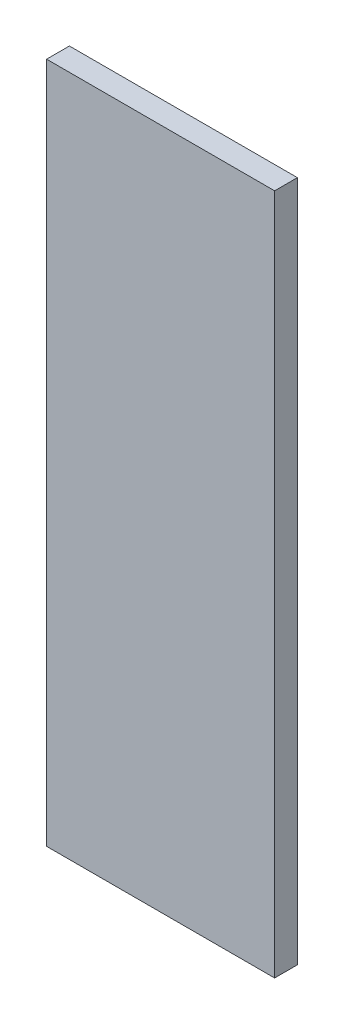
ISO-10303-21;
HEADER;
FILE_DESCRIPTION(('STEP AP214'),'2;1');
FILE_NAME('part.step','',(''),(''),'','','');
FILE_SCHEMA(('AUTOMOTIVE_DESIGN { 1 0 10303 214 1 1 1 1 }'));
ENDSEC;
DATA;
#1=APPLICATION_CONTEXT('core data for automotive mechanical design processes');
#2=APPLICATION_PROTOCOL_DEFINITION('international standard','automotive_design',2000,#1);
#3=PRODUCT_CONTEXT('',#1,'mechanical');
#4=PRODUCT('Part','Part','',(#3));
#5=PRODUCT_RELATED_PRODUCT_CATEGORY('part','',(#4));
#6=PRODUCT_DEFINITION_FORMATION('','',#4);
#7=PRODUCT_DEFINITION_CONTEXT('part definition',#1,'design');
#8=PRODUCT_DEFINITION('design','',#6,#7);
#9=PRODUCT_DEFINITION_SHAPE('','',#8);
#10=(LENGTH_UNIT() NAMED_UNIT(*) SI_UNIT(.MILLI.,.METRE.));
#11=(NAMED_UNIT(*) PLANE_ANGLE_UNIT() SI_UNIT($,.RADIAN.));
#12=(NAMED_UNIT(*) SI_UNIT($,.STERADIAN.) SOLID_ANGLE_UNIT());
#13=UNCERTAINTY_MEASURE_WITH_UNIT(LENGTH_MEASURE(1.E-05),#10,'distance_accuracy_value','');
#14=(GEOMETRIC_REPRESENTATION_CONTEXT(3) GLOBAL_UNCERTAINTY_ASSIGNED_CONTEXT((#13)) GLOBAL_UNIT_ASSIGNED_CONTEXT((#10,
#11,#12)) REPRESENTATION_CONTEXT('',''));
#15=CARTESIAN_POINT('',(0.,0.,0.));
#16=DIRECTION('',(0.,0.,1.));
#17=DIRECTION('',(1.,0.,0.));
#18=AXIS2_PLACEMENT_3D('',#15,#16,#17);
#19=CARTESIAN_POINT('',(20.,59.8,4.));
#20=DIRECTION('',(-1.,0.,0.));
#21=DIRECTION('',(0.,-1.,0.));
#22=AXIS2_PLACEMENT_3D('',#19,#20,#21);
#23=PLANE('',#22);
#24=DIRECTION('',(0.,1.,0.));
#25=VECTOR('',#24,1.);
#26=CARTESIAN_POINT('',(20.,59.8,0.));
#27=LINE('',#26,#25);
#28=CARTESIAN_POINT('',(20.,-59.8,0.));
#29=VERTEX_POINT('',#28);
#30=CARTESIAN_POINT('',(20.,59.8,0.));
#31=VERTEX_POINT('',#30);
#32=EDGE_CURVE('E107',#29,#31,#27,.T.);
#33=ORIENTED_EDGE('',*,*,#32,.T.);
#34=DIRECTION('',(0.,0.,-1.));
#35=VECTOR('',#34,1.);
#36=CARTESIAN_POINT('',(20.,59.8,4.));
#37=LINE('',#36,#35);
#38=CARTESIAN_POINT('',(20.,59.8,4.));
#39=VERTEX_POINT('',#38);
#40=EDGE_CURVE('E11',#39,#31,#37,.T.);
#41=ORIENTED_EDGE('',*,*,#40,.F.);
#42=DIRECTION('',(0.,1.,0.));
#43=VECTOR('',#42,1.);
#44=CARTESIAN_POINT('',(20.,59.8,4.));
#45=LINE('',#44,#43);
#46=CARTESIAN_POINT('',(20.,-59.8,4.));
#47=VERTEX_POINT('',#46);
#48=EDGE_CURVE('E91',#47,#39,#45,.T.);
#49=ORIENTED_EDGE('',*,*,#48,.F.);
#50=DIRECTION('',(0.,0.,-1.));
#51=VECTOR('',#50,1.);
#52=CARTESIAN_POINT('',(20.,-59.8,4.));
#53=LINE('',#52,#51);
#54=EDGE_CURVE('E103',#47,#29,#53,.T.);
#55=ORIENTED_EDGE('',*,*,#54,.T.);
#56=EDGE_LOOP('',(#33,#41,#49,#55));
#57=FACE_BOUND('',#56,.T.);
#58=ADVANCED_FACE('F39',(#57),#23,.F.);
#59=CARTESIAN_POINT('',(-20.,59.8,4.));
#60=DIRECTION('',(0.,-1.,0.));
#61=DIRECTION('',(0.,0.,-1.));
#62=AXIS2_PLACEMENT_3D('',#59,#60,#61);
#63=PLANE('',#62);
#64=DIRECTION('',(-1.,0.,0.));
#65=VECTOR('',#64,1.);
#66=CARTESIAN_POINT('',(-20.,59.8,0.));
#67=LINE('',#66,#65);
#68=CARTESIAN_POINT('',(-20.,59.8,0.));
#69=VERTEX_POINT('',#68);
#70=EDGE_CURVE('E96',#31,#69,#67,.T.);
#71=ORIENTED_EDGE('',*,*,#70,.T.);
#72=DIRECTION('',(0.,0.,-1.));
#73=VECTOR('',#72,1.);
#74=CARTESIAN_POINT('',(-20.,59.8,4.));
#75=LINE('',#74,#73);
#76=CARTESIAN_POINT('',(-20.,59.8,4.));
#77=VERTEX_POINT('',#76);
#78=EDGE_CURVE('E48',#77,#69,#75,.T.);
#79=ORIENTED_EDGE('',*,*,#78,.F.);
#80=DIRECTION('',(-1.,0.,0.));
#81=VECTOR('',#80,1.);
#82=CARTESIAN_POINT('',(-20.,59.8,4.));
#83=LINE('',#82,#81);
#84=EDGE_CURVE('E86',#39,#77,#83,.T.);
#85=ORIENTED_EDGE('',*,*,#84,.F.);
#86=ORIENTED_EDGE('',*,*,#40,.T.);
#87=EDGE_LOOP('',(#71,#79,#85,#86));
#88=FACE_BOUND('',#87,.T.);
#89=ADVANCED_FACE('F95',(#88),#63,.F.);
#90=CARTESIAN_POINT('',(-20.,59.8,4.));
#91=DIRECTION('',(1.,0.,0.));
#92=DIRECTION('',(0.,1.,0.));
#93=AXIS2_PLACEMENT_3D('',#90,#91,#92);
#94=PLANE('',#93);
#95=DIRECTION('',(0.,-1.,0.));
#96=VECTOR('',#95,1.);
#97=CARTESIAN_POINT('',(-20.,59.8,0.));
#98=LINE('',#97,#96);
#99=CARTESIAN_POINT('',(-20.,-59.8,0.));
#100=VERTEX_POINT('',#99);
#101=EDGE_CURVE('E73',#69,#100,#98,.T.);
#102=ORIENTED_EDGE('',*,*,#101,.T.);
#103=DIRECTION('',(0.,0.,-1.));
#104=VECTOR('',#103,1.);
#105=CARTESIAN_POINT('',(-20.,-59.8,4.));
#106=LINE('',#105,#104);
#107=CARTESIAN_POINT('',(-20.,-59.8,4.));
#108=VERTEX_POINT('',#107);
#109=EDGE_CURVE('E98',#108,#100,#106,.T.);
#110=ORIENTED_EDGE('',*,*,#109,.F.);
#111=DIRECTION('',(0.,-1.,0.));
#112=VECTOR('',#111,1.);
#113=CARTESIAN_POINT('',(-20.,59.8,4.));
#114=LINE('',#113,#112);
#115=EDGE_CURVE('E89',#77,#108,#114,.T.);
#116=ORIENTED_EDGE('',*,*,#115,.F.);
#117=ORIENTED_EDGE('',*,*,#78,.T.);
#118=EDGE_LOOP('',(#102,#110,#116,#117));
#119=FACE_BOUND('',#118,.T.);
#120=ADVANCED_FACE('F99',(#119),#94,.F.);
#121=CARTESIAN_POINT('',(-20.,-59.8,4.));
#122=DIRECTION('',(0.,1.,0.));
#123=DIRECTION('',(0.,0.,1.));
#124=AXIS2_PLACEMENT_3D('',#121,#122,#123);
#125=PLANE('',#124);
#126=DIRECTION('',(1.,0.,0.));
#127=VECTOR('',#126,1.);
#128=CARTESIAN_POINT('',(-20.,-59.8,0.));
#129=LINE('',#128,#127);
#130=EDGE_CURVE('E79',#100,#29,#129,.T.);
#131=ORIENTED_EDGE('',*,*,#130,.T.);
#132=ORIENTED_EDGE('',*,*,#54,.F.);
#133=DIRECTION('',(1.,0.,0.));
#134=VECTOR('',#133,1.);
#135=CARTESIAN_POINT('',(-20.,-59.8,4.));
#136=LINE('',#135,#134);
#137=EDGE_CURVE('E56',#108,#47,#136,.T.);
#138=ORIENTED_EDGE('',*,*,#137,.F.);
#139=ORIENTED_EDGE('',*,*,#109,.T.);
#140=EDGE_LOOP('',(#131,#132,#138,#139));
#141=FACE_BOUND('',#140,.T.);
#142=ADVANCED_FACE('F120',(#141),#125,.F.);
#143=CARTESIAN_POINT('',(0.,0.,4.));
#144=DIRECTION('',(0.,0.,1.));
#145=DIRECTION('',(1.,0.,0.));
#146=AXIS2_PLACEMENT_3D('',#143,#144,#145);
#147=PLANE('',#146);
#148=ORIENTED_EDGE('',*,*,#48,.T.);
#149=ORIENTED_EDGE('',*,*,#84,.T.);
#150=ORIENTED_EDGE('',*,*,#115,.T.);
#151=ORIENTED_EDGE('',*,*,#137,.T.);
#152=EDGE_LOOP('',(#148,#149,#150,#151));
#153=FACE_BOUND('',#152,.T.);
#154=ADVANCED_FACE('F87',(#153),#147,.T.);
#155=CARTESIAN_POINT('',(0.,0.,0.));
#156=DIRECTION('',(0.,0.,1.));
#157=DIRECTION('',(1.,0.,0.));
#158=AXIS2_PLACEMENT_3D('',#155,#156,#157);
#159=PLANE('',#158);
#160=ORIENTED_EDGE('',*,*,#32,.F.);
#161=ORIENTED_EDGE('',*,*,#130,.F.);
#162=ORIENTED_EDGE('',*,*,#101,.F.);
#163=ORIENTED_EDGE('',*,*,#70,.F.);
#164=EDGE_LOOP('',(#160,#161,#162,#163));
#165=FACE_BOUND('',#164,.T.);
#166=ADVANCED_FACE('F123',(#165),#159,.F.);
#167=CLOSED_SHELL('',(#58,#89,#120,#142,#154,#166));
#168=MANIFOLD_SOLID_BREP('B2',#167);
#169=ADVANCED_BREP_SHAPE_REPRESENTATION('',(#18,#168),#14);
#170=SHAPE_DEFINITION_REPRESENTATION(#9,#169);
ENDSEC;
END-ISO-10303-21;
